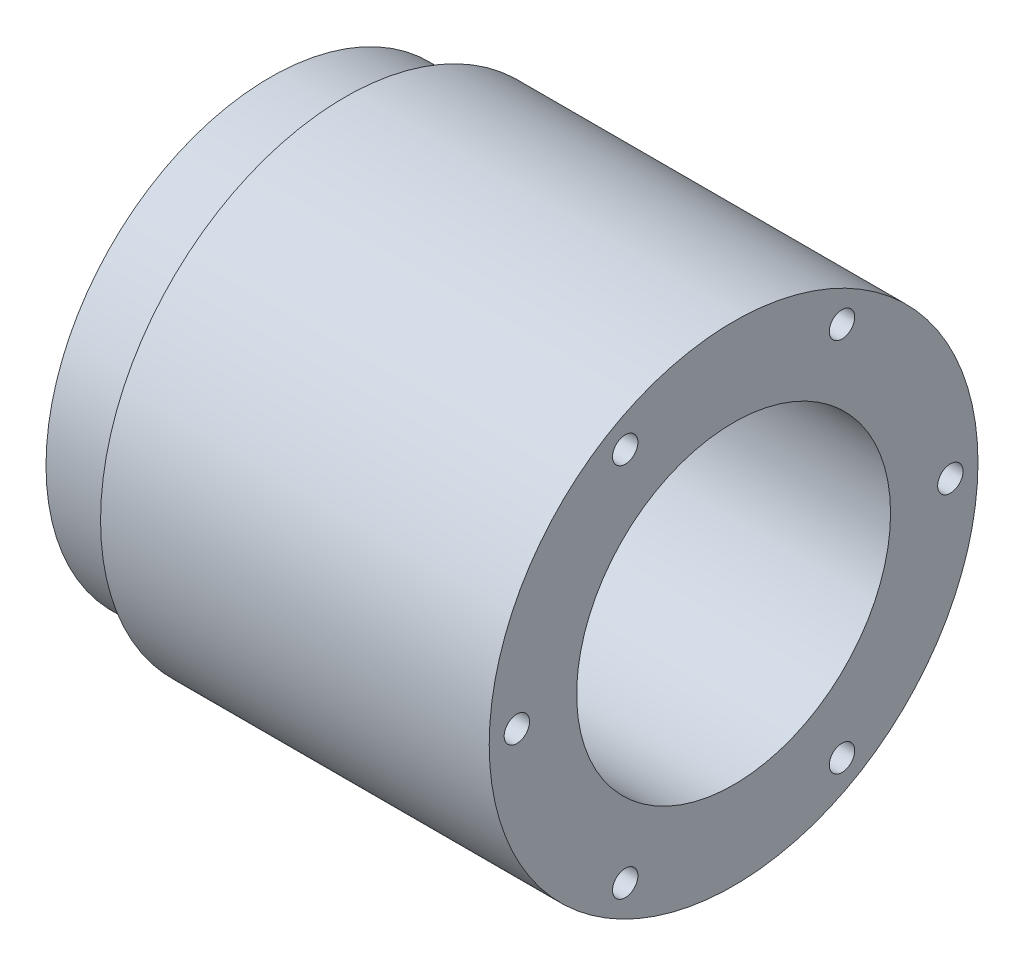
ISO-10303-21;
HEADER;
FILE_DESCRIPTION(('STEP AP214'),'2;1');
FILE_NAME('part.step','',(''),(''),'','','');
FILE_SCHEMA(('AUTOMOTIVE_DESIGN { 1 0 10303 214 1 1 1 1 }'));
ENDSEC;
DATA;
#1=APPLICATION_CONTEXT('core data for automotive mechanical design processes');
#2=APPLICATION_PROTOCOL_DEFINITION('international standard','automotive_design',2000,#1);
#3=PRODUCT_CONTEXT('',#1,'mechanical');
#4=PRODUCT('Part','Part','',(#3));
#5=PRODUCT_RELATED_PRODUCT_CATEGORY('part','',(#4));
#6=PRODUCT_DEFINITION_FORMATION('','',#4);
#7=PRODUCT_DEFINITION_CONTEXT('part definition',#1,'design');
#8=PRODUCT_DEFINITION('design','',#6,#7);
#9=PRODUCT_DEFINITION_SHAPE('','',#8);
#10=(LENGTH_UNIT() NAMED_UNIT(*) SI_UNIT(.MILLI.,.METRE.));
#11=(NAMED_UNIT(*) PLANE_ANGLE_UNIT() SI_UNIT($,.RADIAN.));
#12=(NAMED_UNIT(*) SI_UNIT($,.STERADIAN.) SOLID_ANGLE_UNIT());
#13=UNCERTAINTY_MEASURE_WITH_UNIT(LENGTH_MEASURE(1.E-05),#10,'distance_accuracy_value','');
#14=(GEOMETRIC_REPRESENTATION_CONTEXT(3) GLOBAL_UNCERTAINTY_ASSIGNED_CONTEXT((#13)) GLOBAL_UNIT_ASSIGNED_CONTEXT((#10,
#11,#12)) REPRESENTATION_CONTEXT('',''));
#15=CARTESIAN_POINT('',(0.,0.,0.));
#16=DIRECTION('',(0.,0.,1.));
#17=DIRECTION('',(1.,0.,0.));
#18=AXIS2_PLACEMENT_3D('',#15,#16,#17);
#19=CARTESIAN_POINT('',(-23.5,0.,0.));
#20=DIRECTION('',(1.,0.,0.));
#21=DIRECTION('',(0.,0.,-1.));
#22=AXIS2_PLACEMENT_3D('',#19,#20,#21);
#23=PLANE('',#22);
#24=CARTESIAN_POINT('',(-23.5,0.,0.));
#25=DIRECTION('',(1.,0.,0.));
#26=DIRECTION('',(0.,0.,-1.));
#27=AXIS2_PLACEMENT_3D('',#24,#25,#26);
#28=CIRCLE('',#27,21.);
#29=CARTESIAN_POINT('',(-23.5,0.,21.));
#30=VERTEX_POINT('',#29);
#31=CARTESIAN_POINT('',(-23.5,-12.3354484197474,16.9951967415429));
#32=VERTEX_POINT('',#31);
#33=EDGE_CURVE('E413',#30,#32,#28,.T.);
#34=ORIENTED_EDGE('',*,*,#33,.T.);
#35=CARTESIAN_POINT('',(-23.5,-15.5,15.5));
#36=DIRECTION('',(-1.,0.,0.));
#37=DIRECTION('',(0.,0.,1.));
#38=AXIS2_PLACEMENT_3D('',#35,#36,#37);
#39=CIRCLE('',#38,3.5);
#40=CARTESIAN_POINT('',(-23.5,-16.9951967415429,12.3354484197474));
#41=VERTEX_POINT('',#40);
#42=EDGE_CURVE('E245',#41,#32,#39,.T.);
#43=ORIENTED_EDGE('',*,*,#42,.F.);
#44=CARTESIAN_POINT('',(-23.5,-21.,0.));
#45=VERTEX_POINT('',#44);
#46=EDGE_CURVE('E414',#41,#45,#28,.T.);
#47=ORIENTED_EDGE('',*,*,#46,.T.);
#48=DIRECTION('',(0.,0.,1.));
#49=VECTOR('',#48,1.);
#50=CARTESIAN_POINT('',(-23.5,-21.,-18.));
#51=LINE('',#50,#49);
#52=CARTESIAN_POINT('',(-23.5,-21.,18.));
#53=VERTEX_POINT('',#52);
#54=EDGE_CURVE('E288',#45,#53,#51,.T.);
#55=ORIENTED_EDGE('',*,*,#54,.T.);
#56=CARTESIAN_POINT('',(-23.5,-18.,18.));
#57=DIRECTION('',(-1.,0.,0.));
#58=DIRECTION('',(0.,0.,1.));
#59=AXIS2_PLACEMENT_3D('',#56,#57,#58);
#60=CIRCLE('',#59,3.);
#61=CARTESIAN_POINT('',(-23.5,-18.,21.));
#62=VERTEX_POINT('',#61);
#63=EDGE_CURVE('E259',#53,#62,#60,.T.);
#64=ORIENTED_EDGE('',*,*,#63,.T.);
#65=DIRECTION('',(0.,1.,0.));
#66=VECTOR('',#65,1.);
#67=CARTESIAN_POINT('',(-23.5,18.,21.));
#68=LINE('',#67,#66);
#69=EDGE_CURVE('E263',#62,#30,#68,.T.);
#70=ORIENTED_EDGE('',*,*,#69,.T.);
#71=EDGE_LOOP('',(#34,#43,#47,#55,#64,#70));
#72=FACE_BOUND('',#71,.T.);
#73=ADVANCED_FACE('F32',(#72),#23,.F.);
#74=CARTESIAN_POINT('',(-23.5,21.,0.));
#75=VERTEX_POINT('',#74);
#76=CARTESIAN_POINT('',(-23.5,16.9951967415429,12.3354484197474));
#77=VERTEX_POINT('',#76);
#78=EDGE_CURVE('E318',#75,#77,#28,.T.);
#79=ORIENTED_EDGE('',*,*,#78,.T.);
#80=CARTESIAN_POINT('',(-23.5,15.5,15.5));
#81=DIRECTION('',(-1.,0.,0.));
#82=DIRECTION('',(0.,0.,1.));
#83=AXIS2_PLACEMENT_3D('',#80,#81,#82);
#84=CIRCLE('',#83,3.5);
#85=CARTESIAN_POINT('',(-23.5,12.3354484197474,16.9951967415429));
#86=VERTEX_POINT('',#85);
#87=EDGE_CURVE('E249',#86,#77,#84,.T.);
#88=ORIENTED_EDGE('',*,*,#87,.F.);
#89=EDGE_CURVE('E317',#86,#30,#28,.T.);
#90=ORIENTED_EDGE('',*,*,#89,.T.);
#91=CARTESIAN_POINT('',(-23.5,18.,21.));
#92=VERTEX_POINT('',#91);
#93=EDGE_CURVE('E267',#30,#92,#68,.T.);
#94=ORIENTED_EDGE('',*,*,#93,.T.);
#95=CARTESIAN_POINT('',(-23.5,18.,18.));
#96=DIRECTION('',(-1.,0.,0.));
#97=DIRECTION('',(0.,0.,-1.));
#98=AXIS2_PLACEMENT_3D('',#95,#96,#97);
#99=CIRCLE('',#98,3.);
#100=CARTESIAN_POINT('',(-23.5,21.,18.));
#101=VERTEX_POINT('',#100);
#102=EDGE_CURVE('E266',#92,#101,#99,.T.);
#103=ORIENTED_EDGE('',*,*,#102,.T.);
#104=DIRECTION('',(0.,0.,-1.));
#105=VECTOR('',#104,1.);
#106=CARTESIAN_POINT('',(-23.5,21.,-18.));
#107=LINE('',#106,#105);
#108=EDGE_CURVE('E270',#101,#75,#107,.T.);
#109=ORIENTED_EDGE('',*,*,#108,.T.);
#110=EDGE_LOOP('',(#79,#88,#90,#94,#103,#109));
#111=FACE_BOUND('',#110,.T.);
#112=ADVANCED_FACE('F373',(#111),#23,.F.);
#113=CARTESIAN_POINT('',(-23.5,0.,-21.));
#114=VERTEX_POINT('',#113);
#115=CARTESIAN_POINT('',(-23.5,12.3354484197474,-16.9951967415429));
#116=VERTEX_POINT('',#115);
#117=EDGE_CURVE('E313',#114,#116,#28,.T.);
#118=ORIENTED_EDGE('',*,*,#117,.T.);
#119=CARTESIAN_POINT('',(-23.5,15.5,-15.5));
#120=DIRECTION('',(-1.,0.,0.));
#121=DIRECTION('',(0.,0.,1.));
#122=AXIS2_PLACEMENT_3D('',#119,#120,#121);
#123=CIRCLE('',#122,3.5);
#124=CARTESIAN_POINT('',(-23.5,16.9951967415429,-12.3354484197474));
#125=VERTEX_POINT('',#124);
#126=EDGE_CURVE('E250',#125,#116,#123,.T.);
#127=ORIENTED_EDGE('',*,*,#126,.F.);
#128=EDGE_CURVE('E316',#125,#75,#28,.T.);
#129=ORIENTED_EDGE('',*,*,#128,.T.);
#130=CARTESIAN_POINT('',(-23.5,21.,-18.));
#131=VERTEX_POINT('',#130);
#132=EDGE_CURVE('E274',#75,#131,#107,.T.);
#133=ORIENTED_EDGE('',*,*,#132,.T.);
#134=CARTESIAN_POINT('',(-23.5,18.,-18.));
#135=DIRECTION('',(-1.,0.,0.));
#136=DIRECTION('',(0.,0.,1.));
#137=AXIS2_PLACEMENT_3D('',#134,#135,#136);
#138=CIRCLE('',#137,3.);
#139=CARTESIAN_POINT('',(-23.5,18.,-21.));
#140=VERTEX_POINT('',#139);
#141=EDGE_CURVE('E273',#131,#140,#138,.T.);
#142=ORIENTED_EDGE('',*,*,#141,.T.);
#143=DIRECTION('',(0.,-1.,0.));
#144=VECTOR('',#143,1.);
#145=CARTESIAN_POINT('',(-23.5,18.,-21.));
#146=LINE('',#145,#144);
#147=EDGE_CURVE('E277',#140,#114,#146,.T.);
#148=ORIENTED_EDGE('',*,*,#147,.T.);
#149=EDGE_LOOP('',(#118,#127,#129,#133,#142,#148));
#150=FACE_BOUND('',#149,.T.);
#151=ADVANCED_FACE('F379',(#150),#23,.F.);
#152=CARTESIAN_POINT('',(23.5,0.,0.));
#153=DIRECTION('',(1.,0.,0.));
#154=DIRECTION('',(0.,0.,-1.));
#155=AXIS2_PLACEMENT_3D('',#152,#153,#154);
#156=PLANE('',#155);
#157=CARTESIAN_POINT('',(23.5,0.,-29.));
#158=DIRECTION('',(1.,0.,0.));
#159=DIRECTION('',(0.,0.,-1.));
#160=AXIS2_PLACEMENT_3D('',#157,#158,#159);
#161=CIRCLE('',#160,1.69999999999999);
#162=CARTESIAN_POINT('',(23.5,0.,-30.7));
#163=VERTEX_POINT('',#162);
#164=EDGE_CURVE('E185',#163,#163,#161,.T.);
#165=ORIENTED_EDGE('',*,*,#164,.F.);
#166=EDGE_LOOP('',(#165));
#167=FACE_BOUND('',#166,.T.);
#168=CARTESIAN_POINT('',(23.5,-25.1147367097487,-14.5));
#169=DIRECTION('',(1.,0.,0.));
#170=DIRECTION('',(0.,0.,-1.));
#171=AXIS2_PLACEMENT_3D('',#168,#169,#170);
#172=CIRCLE('',#171,1.69999999999999);
#173=CARTESIAN_POINT('',(23.5,-25.1147367097487,-16.2));
#174=VERTEX_POINT('',#173);
#175=EDGE_CURVE('E184',#174,#174,#172,.T.);
#176=ORIENTED_EDGE('',*,*,#175,.F.);
#177=EDGE_LOOP('',(#176));
#178=FACE_BOUND('',#177,.T.);
#179=CARTESIAN_POINT('',(23.5,-25.1147367097487,14.5));
#180=DIRECTION('',(1.,0.,0.));
#181=DIRECTION('',(0.,0.,-1.));
#182=AXIS2_PLACEMENT_3D('',#179,#180,#181);
#183=CIRCLE('',#182,1.69999999999999);
#184=CARTESIAN_POINT('',(23.5,-25.1147367097487,12.8));
#185=VERTEX_POINT('',#184);
#186=EDGE_CURVE('E195',#185,#185,#183,.T.);
#187=ORIENTED_EDGE('',*,*,#186,.F.);
#188=EDGE_LOOP('',(#187));
#189=FACE_BOUND('',#188,.T.);
#190=CARTESIAN_POINT('',(23.5,0.,29.));
#191=DIRECTION('',(1.,0.,0.));
#192=DIRECTION('',(0.,0.,-1.));
#193=AXIS2_PLACEMENT_3D('',#190,#191,#192);
#194=CIRCLE('',#193,1.69999999999999);
#195=CARTESIAN_POINT('',(23.5,0.,27.3));
#196=VERTEX_POINT('',#195);
#197=EDGE_CURVE('E201',#196,#196,#194,.T.);
#198=ORIENTED_EDGE('',*,*,#197,.F.);
#199=EDGE_LOOP('',(#198));
#200=FACE_BOUND('',#199,.T.);
#201=CARTESIAN_POINT('',(23.5,25.1147367097487,14.5));
#202=DIRECTION('',(1.,0.,0.));
#203=DIRECTION('',(0.,0.,-1.));
#204=AXIS2_PLACEMENT_3D('',#201,#202,#203);
#205=CIRCLE('',#204,1.69999999999999);
#206=CARTESIAN_POINT('',(23.5,25.1147367097487,12.8));
#207=VERTEX_POINT('',#206);
#208=EDGE_CURVE('E207',#207,#207,#205,.T.);
#209=ORIENTED_EDGE('',*,*,#208,.F.);
#210=EDGE_LOOP('',(#209));
#211=FACE_BOUND('',#210,.T.);
#212=CARTESIAN_POINT('',(23.5,25.1147367097487,-14.5));
#213=DIRECTION('',(1.,0.,0.));
#214=DIRECTION('',(0.,0.,-1.));
#215=AXIS2_PLACEMENT_3D('',#212,#213,#214);
#216=CIRCLE('',#215,1.69999999999999);
#217=CARTESIAN_POINT('',(23.5,25.1147367097487,-16.2));
#218=VERTEX_POINT('',#217);
#219=EDGE_CURVE('E213',#218,#218,#216,.T.);
#220=ORIENTED_EDGE('',*,*,#219,.F.);
#221=EDGE_LOOP('',(#220));
#222=FACE_BOUND('',#221,.T.);
#223=CARTESIAN_POINT('',(23.5,0.,0.));
#224=DIRECTION('',(1.,0.,0.));
#225=DIRECTION('',(0.,0.,-1.));
#226=AXIS2_PLACEMENT_3D('',#223,#224,#225);
#227=CIRCLE('',#226,32.7);
#228=CARTESIAN_POINT('',(23.5,0.,-32.7));
#229=VERTEX_POINT('',#228);
#230=EDGE_CURVE('E312',#229,#229,#227,.T.);
#231=ORIENTED_EDGE('',*,*,#230,.T.);
#232=EDGE_LOOP('',(#231));
#233=FACE_BOUND('',#232,.T.);
#234=CARTESIAN_POINT('',(23.5,0.,0.));
#235=DIRECTION('',(1.,0.,0.));
#236=DIRECTION('',(0.,0.,-1.));
#237=AXIS2_PLACEMENT_3D('',#234,#235,#236);
#238=CIRCLE('',#237,21.);
#239=CARTESIAN_POINT('',(23.5,0.,-21.));
#240=VERTEX_POINT('',#239);
#241=EDGE_CURVE('E309',#240,#240,#238,.T.);
#242=ORIENTED_EDGE('',*,*,#241,.F.);
#243=EDGE_LOOP('',(#242));
#244=FACE_BOUND('',#243,.T.);
#245=ADVANCED_FACE('F383',(#167,#178,#189,#200,#211,#222,#233,#244),#156,.T.);
#246=CARTESIAN_POINT('',(-23.5,-16.9951967415429,-12.3354484197474));
#247=VERTEX_POINT('',#246);
#248=EDGE_CURVE('E412',#45,#247,#28,.T.);
#249=ORIENTED_EDGE('',*,*,#248,.T.);
#250=CARTESIAN_POINT('',(-23.5,-15.5,-15.5));
#251=DIRECTION('',(-1.,0.,0.));
#252=DIRECTION('',(0.,0.,1.));
#253=AXIS2_PLACEMENT_3D('',#250,#251,#252);
#254=CIRCLE('',#253,3.5);
#255=CARTESIAN_POINT('',(-23.5,-12.3354484197474,-16.9951967415429));
#256=VERTEX_POINT('',#255);
#257=EDGE_CURVE('E253',#256,#247,#254,.T.);
#258=ORIENTED_EDGE('',*,*,#257,.F.);
#259=EDGE_CURVE('E308',#256,#114,#28,.T.);
#260=ORIENTED_EDGE('',*,*,#259,.T.);
#261=CARTESIAN_POINT('',(-23.5,-18.,-21.));
#262=VERTEX_POINT('',#261);
#263=EDGE_CURVE('E281',#114,#262,#146,.T.);
#264=ORIENTED_EDGE('',*,*,#263,.T.);
#265=CARTESIAN_POINT('',(-23.5,-18.,-18.));
#266=DIRECTION('',(-1.,0.,0.));
#267=DIRECTION('',(0.,0.,1.));
#268=AXIS2_PLACEMENT_3D('',#265,#266,#267);
#269=CIRCLE('',#268,3.);
#270=CARTESIAN_POINT('',(-23.5,-21.,-18.));
#271=VERTEX_POINT('',#270);
#272=EDGE_CURVE('E280',#262,#271,#269,.T.);
#273=ORIENTED_EDGE('',*,*,#272,.T.);
#274=EDGE_CURVE('E284',#271,#45,#51,.T.);
#275=ORIENTED_EDGE('',*,*,#274,.T.);
#276=EDGE_LOOP('',(#249,#258,#260,#264,#273,#275));
#277=FACE_BOUND('',#276,.T.);
#278=ADVANCED_FACE('F375',(#277),#23,.F.);
#279=CARTESIAN_POINT('',(23.5,0.,0.));
#280=DIRECTION('',(-1.,0.,0.));
#281=DIRECTION('',(0.,0.,1.));
#282=AXIS2_PLACEMENT_3D('',#279,#280,#281);
#283=CYLINDRICAL_SURFACE('',#282,32.7);
#284=ORIENTED_EDGE('',*,*,#230,.F.);
#285=EDGE_LOOP('',(#284));
#286=FACE_BOUND('',#285,.T.);
#287=CARTESIAN_POINT('',(-28.5,0.,0.));
#288=DIRECTION('',(-1.,0.,0.));
#289=DIRECTION('',(0.,0.,1.));
#290=AXIS2_PLACEMENT_3D('',#287,#288,#289);
#291=CIRCLE('',#290,32.7);
#292=CARTESIAN_POINT('',(-28.5,0.,32.7));
#293=VERTEX_POINT('',#292);
#294=EDGE_CURVE('E305',#293,#293,#291,.T.);
#295=ORIENTED_EDGE('',*,*,#294,.F.);
#296=EDGE_LOOP('',(#295));
#297=FACE_BOUND('',#296,.T.);
#298=ADVANCED_FACE('F34',(#286,#297),#283,.T.);
#299=CARTESIAN_POINT('',(23.5,0.,0.));
#300=DIRECTION('',(-1.,0.,0.));
#301=DIRECTION('',(0.,0.,1.));
#302=AXIS2_PLACEMENT_3D('',#299,#300,#301);
#303=CYLINDRICAL_SURFACE('',#302,21.);
#304=DIRECTION('',(-1.,0.,0.));
#305=VECTOR('',#304,1.);
#306=CARTESIAN_POINT('',(-20.5,-12.3354484197474,16.9951967415429));
#307=LINE('',#306,#305);
#308=CARTESIAN_POINT('',(-17.5,-12.3354484197474,16.9951967415429));
#309=VERTEX_POINT('',#308);
#310=EDGE_CURVE('E36',#32,#309,#307,.F.);
#311=ORIENTED_EDGE('',*,*,#310,.F.);
#312=ORIENTED_EDGE('',*,*,#33,.F.);
#313=ORIENTED_EDGE('',*,*,#89,.F.);
#314=DIRECTION('',(-1.,0.,0.));
#315=VECTOR('',#314,1.);
#316=CARTESIAN_POINT('',(-20.5,12.3354484197474,16.9951967415429));
#317=LINE('',#316,#315);
#318=CARTESIAN_POINT('',(-17.5,12.3354484197474,16.9951967415429));
#319=VERTEX_POINT('',#318);
#320=EDGE_CURVE('E324',#319,#86,#317,.T.);
#321=ORIENTED_EDGE('',*,*,#320,.F.);
#322=CARTESIAN_POINT('',(-17.5,0.,0.));
#323=DIRECTION('',(-1.,0.,0.));
#324=DIRECTION('',(0.,0.,1.));
#325=AXIS2_PLACEMENT_3D('',#322,#323,#324);
#326=CIRCLE('',#325,21.);
#327=CARTESIAN_POINT('',(-17.5,16.9951967415429,12.3354484197474));
#328=VERTEX_POINT('',#327);
#329=EDGE_CURVE('E321',#319,#328,#326,.T.);
#330=ORIENTED_EDGE('',*,*,#329,.T.);
#331=DIRECTION('',(-1.,0.,0.));
#332=VECTOR('',#331,1.);
#333=CARTESIAN_POINT('',(-20.5,16.9951967415429,12.3354484197474));
#334=LINE('',#333,#332);
#335=EDGE_CURVE('E326',#77,#328,#334,.F.);
#336=ORIENTED_EDGE('',*,*,#335,.F.);
#337=ORIENTED_EDGE('',*,*,#78,.F.);
#338=ORIENTED_EDGE('',*,*,#128,.F.);
#339=DIRECTION('',(-1.,0.,0.));
#340=VECTOR('',#339,1.);
#341=CARTESIAN_POINT('',(-20.5,16.9951967415429,-12.3354484197474));
#342=LINE('',#341,#340);
#343=CARTESIAN_POINT('',(-17.5,16.9951967415429,-12.3354484197474));
#344=VERTEX_POINT('',#343);
#345=EDGE_CURVE('E332',#344,#125,#342,.T.);
#346=ORIENTED_EDGE('',*,*,#345,.F.);
#347=CARTESIAN_POINT('',(-17.5,0.,0.));
#348=DIRECTION('',(-1.,0.,0.));
#349=DIRECTION('',(0.,0.,1.));
#350=AXIS2_PLACEMENT_3D('',#347,#348,#349);
#351=CIRCLE('',#350,21.);
#352=CARTESIAN_POINT('',(-17.5,12.3354484197474,-16.9951967415429));
#353=VERTEX_POINT('',#352);
#354=EDGE_CURVE('E329',#344,#353,#351,.T.);
#355=ORIENTED_EDGE('',*,*,#354,.T.);
#356=DIRECTION('',(-1.,0.,0.));
#357=VECTOR('',#356,1.);
#358=CARTESIAN_POINT('',(-20.5,12.3354484197474,-16.9951967415429));
#359=LINE('',#358,#357);
#360=EDGE_CURVE('E334',#116,#353,#359,.F.);
#361=ORIENTED_EDGE('',*,*,#360,.F.);
#362=ORIENTED_EDGE('',*,*,#117,.F.);
#363=ORIENTED_EDGE('',*,*,#259,.F.);
#364=DIRECTION('',(-1.,0.,0.));
#365=VECTOR('',#364,1.);
#366=CARTESIAN_POINT('',(-20.5,-12.3354484197474,-16.9951967415429));
#367=LINE('',#366,#365);
#368=CARTESIAN_POINT('',(-17.5,-12.3354484197474,-16.9951967415429));
#369=VERTEX_POINT('',#368);
#370=EDGE_CURVE('E340',#369,#256,#367,.T.);
#371=ORIENTED_EDGE('',*,*,#370,.F.);
#372=CARTESIAN_POINT('',(-17.5,0.,0.));
#373=DIRECTION('',(-1.,0.,0.));
#374=DIRECTION('',(0.,0.,1.));
#375=AXIS2_PLACEMENT_3D('',#372,#373,#374);
#376=CIRCLE('',#375,21.);
#377=CARTESIAN_POINT('',(-17.5,-16.9951967415429,-12.3354484197474));
#378=VERTEX_POINT('',#377);
#379=EDGE_CURVE('E337',#369,#378,#376,.T.);
#380=ORIENTED_EDGE('',*,*,#379,.T.);
#381=DIRECTION('',(-1.,0.,0.));
#382=VECTOR('',#381,1.);
#383=CARTESIAN_POINT('',(-20.5,-16.9951967415429,-12.3354484197474));
#384=LINE('',#383,#382);
#385=EDGE_CURVE('E342',#247,#378,#384,.F.);
#386=ORIENTED_EDGE('',*,*,#385,.F.);
#387=ORIENTED_EDGE('',*,*,#248,.F.);
#388=ORIENTED_EDGE('',*,*,#46,.F.);
#389=DIRECTION('',(-1.,0.,0.));
#390=VECTOR('',#389,1.);
#391=CARTESIAN_POINT('',(-20.5,-16.9951967415429,12.3354484197474));
#392=LINE('',#391,#390);
#393=CARTESIAN_POINT('',(-17.5,-16.9951967415429,12.3354484197474));
#394=VERTEX_POINT('',#393);
#395=EDGE_CURVE('E346',#394,#41,#392,.T.);
#396=ORIENTED_EDGE('',*,*,#395,.F.);
#397=CARTESIAN_POINT('',(-17.5,0.,0.));
#398=DIRECTION('',(-1.,0.,0.));
#399=DIRECTION('',(0.,0.,1.));
#400=AXIS2_PLACEMENT_3D('',#397,#398,#399);
#401=CIRCLE('',#400,21.);
#402=EDGE_CURVE('E344',#394,#309,#401,.T.);
#403=ORIENTED_EDGE('',*,*,#402,.T.);
#404=EDGE_LOOP('',(#311,#312,#313,#321,#330,#336,#337,#338,#346,#355,#361,#362,#363,#371,#380,
#386,#387,#388,#396,#403));
#405=FACE_BOUND('',#404,.T.);
#406=ORIENTED_EDGE('',*,*,#241,.T.);
#407=EDGE_LOOP('',(#406));
#408=FACE_BOUND('',#407,.T.);
#409=ADVANCED_FACE('F355',(#405,#408),#303,.F.);
#410=CARTESIAN_POINT('',(-28.5,0.,0.));
#411=DIRECTION('',(-1.,0.,0.));
#412=DIRECTION('',(0.,0.,1.));
#413=AXIS2_PLACEMENT_3D('',#410,#411,#412);
#414=PLANE('',#413);
#415=CARTESIAN_POINT('',(-28.5,0.,0.));
#416=DIRECTION('',(-1.,0.,0.));
#417=DIRECTION('',(0.,0.,1.));
#418=AXIS2_PLACEMENT_3D('',#415,#416,#417);
#419=CIRCLE('',#418,30.);
#420=CARTESIAN_POINT('',(-28.5,0.,30.));
#421=VERTEX_POINT('',#420);
#422=EDGE_CURVE('E11',#421,#421,#419,.T.);
#423=ORIENTED_EDGE('',*,*,#422,.F.);
#424=EDGE_LOOP('',(#423));
#425=FACE_BOUND('',#424,.T.);
#426=ORIENTED_EDGE('',*,*,#294,.T.);
#427=EDGE_LOOP('',(#426));
#428=FACE_BOUND('',#427,.T.);
#429=ADVANCED_FACE('F533',(#425,#428),#414,.T.);
#430=CARTESIAN_POINT('',(-28.5,-18.,18.));
#431=DIRECTION('',(1.,0.,0.));
#432=DIRECTION('',(0.,0.,-1.));
#433=AXIS2_PLACEMENT_3D('',#430,#431,#432);
#434=CYLINDRICAL_SURFACE('',#433,3.);
#435=ORIENTED_EDGE('',*,*,#63,.F.);
#436=DIRECTION('',(1.,0.,0.));
#437=VECTOR('',#436,1.);
#438=CARTESIAN_POINT('',(-28.5,-21.,18.));
#439=LINE('',#438,#437);
#440=CARTESIAN_POINT('',(-38.5,-21.,18.));
#441=VERTEX_POINT('',#440);
#442=EDGE_CURVE('E287',#441,#53,#439,.T.);
#443=ORIENTED_EDGE('',*,*,#442,.F.);
#444=CARTESIAN_POINT('',(-38.5,-18.,18.));
#445=DIRECTION('',(-1.,0.,0.));
#446=DIRECTION('',(0.,0.,1.));
#447=AXIS2_PLACEMENT_3D('',#444,#445,#446);
#448=CIRCLE('',#447,3.);
#449=CARTESIAN_POINT('',(-38.5,-18.,21.));
#450=VERTEX_POINT('',#449);
#451=EDGE_CURVE('E237',#441,#450,#448,.T.);
#452=ORIENTED_EDGE('',*,*,#451,.T.);
#453=DIRECTION('',(1.,0.,0.));
#454=VECTOR('',#453,1.);
#455=CARTESIAN_POINT('',(-28.5,-18.,21.));
#456=LINE('',#455,#454);
#457=EDGE_CURVE('E302',#450,#62,#456,.T.);
#458=ORIENTED_EDGE('',*,*,#457,.T.);
#459=EDGE_LOOP('',(#435,#443,#452,#458));
#460=FACE_BOUND('',#459,.T.);
#461=ADVANCED_FACE('F430',(#460),#434,.F.);
#462=CARTESIAN_POINT('',(-28.5,18.,21.));
#463=DIRECTION('',(0.,0.,-1.));
#464=DIRECTION('',(-1.,0.,0.));
#465=AXIS2_PLACEMENT_3D('',#462,#463,#464);
#466=PLANE('',#465);
#467=ORIENTED_EDGE('',*,*,#69,.F.);
#468=ORIENTED_EDGE('',*,*,#457,.F.);
#469=DIRECTION('',(0.,1.,0.));
#470=VECTOR('',#469,1.);
#471=CARTESIAN_POINT('',(-38.5,-18.,21.));
#472=LINE('',#471,#470);
#473=CARTESIAN_POINT('',(-38.5,18.,21.));
#474=VERTEX_POINT('',#473);
#475=EDGE_CURVE('E240',#450,#474,#472,.T.);
#476=ORIENTED_EDGE('',*,*,#475,.T.);
#477=DIRECTION('',(1.,0.,0.));
#478=VECTOR('',#477,1.);
#479=CARTESIAN_POINT('',(-28.5,18.,21.));
#480=LINE('',#479,#478);
#481=EDGE_CURVE('E300',#474,#92,#480,.T.);
#482=ORIENTED_EDGE('',*,*,#481,.T.);
#483=ORIENTED_EDGE('',*,*,#93,.F.);
#484=EDGE_LOOP('',(#467,#468,#476,#482,#483));
#485=FACE_BOUND('',#484,.T.);
#486=ADVANCED_FACE('F426',(#485),#466,.T.);
#487=CARTESIAN_POINT('',(-28.5,18.,18.));
#488=DIRECTION('',(1.,0.,0.));
#489=DIRECTION('',(0.,0.,-1.));
#490=AXIS2_PLACEMENT_3D('',#487,#488,#489);
#491=CYLINDRICAL_SURFACE('',#490,3.);
#492=ORIENTED_EDGE('',*,*,#102,.F.);
#493=ORIENTED_EDGE('',*,*,#481,.F.);
#494=CARTESIAN_POINT('',(-38.5,18.,18.));
#495=DIRECTION('',(-1.,0.,0.));
#496=DIRECTION('',(0.,0.,1.));
#497=AXIS2_PLACEMENT_3D('',#494,#495,#496);
#498=CIRCLE('',#497,3.);
#499=CARTESIAN_POINT('',(-38.5,21.,18.));
#500=VERTEX_POINT('',#499);
#501=EDGE_CURVE('E219',#474,#500,#498,.T.);
#502=ORIENTED_EDGE('',*,*,#501,.T.);
#503=DIRECTION('',(1.,0.,0.));
#504=VECTOR('',#503,1.);
#505=CARTESIAN_POINT('',(-28.5,21.,18.));
#506=LINE('',#505,#504);
#507=EDGE_CURVE('E298',#500,#101,#506,.T.);
#508=ORIENTED_EDGE('',*,*,#507,.T.);
#509=EDGE_LOOP('',(#492,#493,#502,#508));
#510=FACE_BOUND('',#509,.T.);
#511=ADVANCED_FACE('F438',(#510),#491,.F.);
#512=CARTESIAN_POINT('',(-28.5,21.,-18.));
#513=DIRECTION('',(0.,-1.,0.));
#514=DIRECTION('',(0.,0.,-1.));
#515=AXIS2_PLACEMENT_3D('',#512,#513,#514);
#516=PLANE('',#515);
#517=ORIENTED_EDGE('',*,*,#108,.F.);
#518=ORIENTED_EDGE('',*,*,#507,.F.);
#519=DIRECTION('',(0.,0.,-1.));
#520=VECTOR('',#519,1.);
#521=CARTESIAN_POINT('',(-38.5,21.,18.));
#522=LINE('',#521,#520);
#523=CARTESIAN_POINT('',(-38.5,21.,-18.));
#524=VERTEX_POINT('',#523);
#525=EDGE_CURVE('E222',#500,#524,#522,.T.);
#526=ORIENTED_EDGE('',*,*,#525,.T.);
#527=DIRECTION('',(1.,0.,0.));
#528=VECTOR('',#527,1.);
#529=CARTESIAN_POINT('',(-28.5,21.,-18.));
#530=LINE('',#529,#528);
#531=EDGE_CURVE('E296',#524,#131,#530,.T.);
#532=ORIENTED_EDGE('',*,*,#531,.T.);
#533=ORIENTED_EDGE('',*,*,#132,.F.);
#534=EDGE_LOOP('',(#517,#518,#526,#532,#533));
#535=FACE_BOUND('',#534,.T.);
#536=ADVANCED_FACE('F441',(#535),#516,.T.);
#537=CARTESIAN_POINT('',(-28.5,18.,-18.));
#538=DIRECTION('',(1.,0.,0.));
#539=DIRECTION('',(0.,0.,-1.));
#540=AXIS2_PLACEMENT_3D('',#537,#538,#539);
#541=CYLINDRICAL_SURFACE('',#540,3.);
#542=ORIENTED_EDGE('',*,*,#141,.F.);
#543=ORIENTED_EDGE('',*,*,#531,.F.);
#544=CARTESIAN_POINT('',(-38.5,18.,-18.));
#545=DIRECTION('',(-1.,0.,0.));
#546=DIRECTION('',(0.,0.,1.));
#547=AXIS2_PLACEMENT_3D('',#544,#545,#546);
#548=CIRCLE('',#547,3.);
#549=CARTESIAN_POINT('',(-38.5,18.,-21.));
#550=VERTEX_POINT('',#549);
#551=EDGE_CURVE('E225',#524,#550,#548,.T.);
#552=ORIENTED_EDGE('',*,*,#551,.T.);
#553=DIRECTION('',(1.,0.,0.));
#554=VECTOR('',#553,1.);
#555=CARTESIAN_POINT('',(-28.5,18.,-21.));
#556=LINE('',#555,#554);
#557=EDGE_CURVE('E294',#550,#140,#556,.T.);
#558=ORIENTED_EDGE('',*,*,#557,.T.);
#559=EDGE_LOOP('',(#542,#543,#552,#558));
#560=FACE_BOUND('',#559,.T.);
#561=ADVANCED_FACE('F549',(#560),#541,.F.);
#562=CARTESIAN_POINT('',(-28.5,18.,-21.));
#563=DIRECTION('',(0.,0.,1.));
#564=DIRECTION('',(1.,0.,0.));
#565=AXIS2_PLACEMENT_3D('',#562,#563,#564);
#566=PLANE('',#565);
#567=ORIENTED_EDGE('',*,*,#147,.F.);
#568=ORIENTED_EDGE('',*,*,#557,.F.);
#569=DIRECTION('',(0.,-1.,0.));
#570=VECTOR('',#569,1.);
#571=CARTESIAN_POINT('',(-38.5,18.,-21.));
#572=LINE('',#571,#570);
#573=CARTESIAN_POINT('',(-38.5,-18.,-21.));
#574=VERTEX_POINT('',#573);
#575=EDGE_CURVE('E228',#550,#574,#572,.T.);
#576=ORIENTED_EDGE('',*,*,#575,.T.);
#577=DIRECTION('',(1.,0.,0.));
#578=VECTOR('',#577,1.);
#579=CARTESIAN_POINT('',(-28.5,-18.,-21.));
#580=LINE('',#579,#578);
#581=EDGE_CURVE('E292',#574,#262,#580,.T.);
#582=ORIENTED_EDGE('',*,*,#581,.T.);
#583=ORIENTED_EDGE('',*,*,#263,.F.);
#584=EDGE_LOOP('',(#567,#568,#576,#582,#583));
#585=FACE_BOUND('',#584,.T.);
#586=ADVANCED_FACE('F445',(#585),#566,.T.);
#587=CARTESIAN_POINT('',(-28.5,-18.,-18.));
#588=DIRECTION('',(1.,0.,0.));
#589=DIRECTION('',(0.,0.,-1.));
#590=AXIS2_PLACEMENT_3D('',#587,#588,#589);
#591=CYLINDRICAL_SURFACE('',#590,3.);
#592=ORIENTED_EDGE('',*,*,#272,.F.);
#593=ORIENTED_EDGE('',*,*,#581,.F.);
#594=CARTESIAN_POINT('',(-38.5,-18.,-18.));
#595=DIRECTION('',(-1.,0.,0.));
#596=DIRECTION('',(0.,0.,1.));
#597=AXIS2_PLACEMENT_3D('',#594,#595,#596);
#598=CIRCLE('',#597,3.);
#599=CARTESIAN_POINT('',(-38.5,-21.,-18.));
#600=VERTEX_POINT('',#599);
#601=EDGE_CURVE('E231',#574,#600,#598,.T.);
#602=ORIENTED_EDGE('',*,*,#601,.T.);
#603=DIRECTION('',(1.,0.,0.));
#604=VECTOR('',#603,1.);
#605=CARTESIAN_POINT('',(-28.5,-21.,-18.));
#606=LINE('',#605,#604);
#607=EDGE_CURVE('E290',#600,#271,#606,.T.);
#608=ORIENTED_EDGE('',*,*,#607,.T.);
#609=EDGE_LOOP('',(#592,#593,#602,#608));
#610=FACE_BOUND('',#609,.T.);
#611=ADVANCED_FACE('F449',(#610),#591,.F.);
#612=CARTESIAN_POINT('',(-28.5,-21.,-18.));
#613=DIRECTION('',(0.,1.,0.));
#614=DIRECTION('',(0.,0.,1.));
#615=AXIS2_PLACEMENT_3D('',#612,#613,#614);
#616=PLANE('',#615);
#617=ORIENTED_EDGE('',*,*,#274,.F.);
#618=ORIENTED_EDGE('',*,*,#607,.F.);
#619=DIRECTION('',(0.,0.,1.));
#620=VECTOR('',#619,1.);
#621=CARTESIAN_POINT('',(-38.5,-21.,-18.));
#622=LINE('',#621,#620);
#623=EDGE_CURVE('E234',#600,#441,#622,.T.);
#624=ORIENTED_EDGE('',*,*,#623,.T.);
#625=ORIENTED_EDGE('',*,*,#442,.T.);
#626=ORIENTED_EDGE('',*,*,#54,.F.);
#627=EDGE_LOOP('',(#617,#618,#624,#625,#626));
#628=FACE_BOUND('',#627,.T.);
#629=ADVANCED_FACE('F453',(#628),#616,.T.);
#630=CARTESIAN_POINT('',(-17.5,15.5,15.5));
#631=DIRECTION('',(-1.,0.,0.));
#632=DIRECTION('',(0.,0.,1.));
#633=AXIS2_PLACEMENT_3D('',#630,#631,#632);
#634=CYLINDRICAL_SURFACE('',#633,3.5);
#635=ORIENTED_EDGE('',*,*,#335,.T.);
#636=CARTESIAN_POINT('',(-17.5,15.5,15.5));
#637=DIRECTION('',(-1.,0.,0.));
#638=DIRECTION('',(0.,0.,1.));
#639=AXIS2_PLACEMENT_3D('',#636,#637,#638);
#640=CIRCLE('',#639,3.5);
#641=EDGE_CURVE('E257',#319,#328,#640,.T.);
#642=ORIENTED_EDGE('',*,*,#641,.F.);
#643=ORIENTED_EDGE('',*,*,#320,.T.);
#644=ORIENTED_EDGE('',*,*,#87,.T.);
#645=EDGE_LOOP('',(#635,#642,#643,#644));
#646=FACE_BOUND('',#645,.T.);
#647=ADVANCED_FACE('F559',(#646),#634,.F.);
#648=CARTESIAN_POINT('',(-17.5,15.5,15.5));
#649=DIRECTION('',(-1.,0.,0.));
#650=DIRECTION('',(0.,0.,1.));
#651=AXIS2_PLACEMENT_3D('',#648,#649,#650);
#652=PLANE('',#651);
#653=ORIENTED_EDGE('',*,*,#641,.T.);
#654=ORIENTED_EDGE('',*,*,#329,.F.);
#655=EDGE_LOOP('',(#653,#654));
#656=FACE_BOUND('',#655,.T.);
#657=ADVANCED_FACE('F469',(#656),#652,.T.);
#658=CARTESIAN_POINT('',(-17.5,15.5,-15.5));
#659=DIRECTION('',(-1.,0.,0.));
#660=DIRECTION('',(0.,0.,1.));
#661=AXIS2_PLACEMENT_3D('',#658,#659,#660);
#662=CYLINDRICAL_SURFACE('',#661,3.5);
#663=ORIENTED_EDGE('',*,*,#360,.T.);
#664=CARTESIAN_POINT('',(-17.5,15.5,-15.5));
#665=DIRECTION('',(-1.,0.,0.));
#666=DIRECTION('',(0.,0.,1.));
#667=AXIS2_PLACEMENT_3D('',#664,#665,#666);
#668=CIRCLE('',#667,3.5);
#669=EDGE_CURVE('E247',#344,#353,#668,.T.);
#670=ORIENTED_EDGE('',*,*,#669,.F.);
#671=ORIENTED_EDGE('',*,*,#345,.T.);
#672=ORIENTED_EDGE('',*,*,#126,.T.);
#673=EDGE_LOOP('',(#663,#670,#671,#672));
#674=FACE_BOUND('',#673,.T.);
#675=ADVANCED_FACE('F406',(#674),#662,.F.);
#676=CARTESIAN_POINT('',(-17.5,15.5,-15.5));
#677=DIRECTION('',(-1.,0.,0.));
#678=DIRECTION('',(0.,0.,1.));
#679=AXIS2_PLACEMENT_3D('',#676,#677,#678);
#680=PLANE('',#679);
#681=ORIENTED_EDGE('',*,*,#669,.T.);
#682=ORIENTED_EDGE('',*,*,#354,.F.);
#683=EDGE_LOOP('',(#681,#682));
#684=FACE_BOUND('',#683,.T.);
#685=ADVANCED_FACE('F459',(#684),#680,.T.);
#686=CARTESIAN_POINT('',(-17.5,-15.5,-15.5));
#687=DIRECTION('',(-1.,0.,0.));
#688=DIRECTION('',(0.,0.,1.));
#689=AXIS2_PLACEMENT_3D('',#686,#687,#688);
#690=CYLINDRICAL_SURFACE('',#689,3.5);
#691=ORIENTED_EDGE('',*,*,#385,.T.);
#692=CARTESIAN_POINT('',(-17.5,-15.5,-15.5));
#693=DIRECTION('',(-1.,0.,0.));
#694=DIRECTION('',(0.,0.,1.));
#695=AXIS2_PLACEMENT_3D('',#692,#693,#694);
#696=CIRCLE('',#695,3.5);
#697=EDGE_CURVE('E54',#369,#378,#696,.T.);
#698=ORIENTED_EDGE('',*,*,#697,.F.);
#699=ORIENTED_EDGE('',*,*,#370,.T.);
#700=ORIENTED_EDGE('',*,*,#257,.T.);
#701=EDGE_LOOP('',(#691,#698,#699,#700));
#702=FACE_BOUND('',#701,.T.);
#703=ADVANCED_FACE('F457',(#702),#690,.F.);
#704=CARTESIAN_POINT('',(-17.5,-15.5,-15.5));
#705=DIRECTION('',(-1.,0.,0.));
#706=DIRECTION('',(0.,0.,1.));
#707=AXIS2_PLACEMENT_3D('',#704,#705,#706);
#708=PLANE('',#707);
#709=ORIENTED_EDGE('',*,*,#697,.T.);
#710=ORIENTED_EDGE('',*,*,#379,.F.);
#711=EDGE_LOOP('',(#709,#710));
#712=FACE_BOUND('',#711,.T.);
#713=ADVANCED_FACE('F369',(#712),#708,.T.);
#714=CARTESIAN_POINT('',(-17.5,-15.5,15.5));
#715=DIRECTION('',(-1.,0.,0.));
#716=DIRECTION('',(0.,0.,1.));
#717=AXIS2_PLACEMENT_3D('',#714,#715,#716);
#718=CYLINDRICAL_SURFACE('',#717,3.5);
#719=ORIENTED_EDGE('',*,*,#310,.T.);
#720=CARTESIAN_POINT('',(-17.5,-15.5,15.5));
#721=DIRECTION('',(-1.,0.,0.));
#722=DIRECTION('',(0.,0.,1.));
#723=AXIS2_PLACEMENT_3D('',#720,#721,#722);
#724=CIRCLE('',#723,3.5);
#725=EDGE_CURVE('E47',#394,#309,#724,.T.);
#726=ORIENTED_EDGE('',*,*,#725,.F.);
#727=ORIENTED_EDGE('',*,*,#395,.T.);
#728=ORIENTED_EDGE('',*,*,#42,.T.);
#729=EDGE_LOOP('',(#719,#726,#727,#728));
#730=FACE_BOUND('',#729,.T.);
#731=ADVANCED_FACE('F351',(#730),#718,.F.);
#732=CARTESIAN_POINT('',(-17.5,-15.5,15.5));
#733=DIRECTION('',(-1.,0.,0.));
#734=DIRECTION('',(0.,0.,1.));
#735=AXIS2_PLACEMENT_3D('',#732,#733,#734);
#736=PLANE('',#735);
#737=ORIENTED_EDGE('',*,*,#725,.T.);
#738=ORIENTED_EDGE('',*,*,#402,.F.);
#739=EDGE_LOOP('',(#737,#738));
#740=FACE_BOUND('',#739,.T.);
#741=ADVANCED_FACE('F358',(#740),#736,.T.);
#742=CARTESIAN_POINT('',(-38.5,0.,0.));
#743=DIRECTION('',(-1.,0.,0.));
#744=DIRECTION('',(0.,0.,1.));
#745=AXIS2_PLACEMENT_3D('',#742,#743,#744);
#746=PLANE('',#745);
#747=CARTESIAN_POINT('',(-38.5,0.,0.));
#748=DIRECTION('',(-1.,0.,0.));
#749=DIRECTION('',(0.,0.,1.));
#750=AXIS2_PLACEMENT_3D('',#747,#748,#749);
#751=CIRCLE('',#750,30.);
#752=CARTESIAN_POINT('',(-38.5,0.,30.));
#753=VERTEX_POINT('',#752);
#754=EDGE_CURVE('E243',#753,#753,#751,.T.);
#755=ORIENTED_EDGE('',*,*,#754,.T.);
#756=EDGE_LOOP('',(#755));
#757=FACE_BOUND('',#756,.T.);
#758=ORIENTED_EDGE('',*,*,#525,.F.);
#759=ORIENTED_EDGE('',*,*,#501,.F.);
#760=ORIENTED_EDGE('',*,*,#475,.F.);
#761=ORIENTED_EDGE('',*,*,#451,.F.);
#762=ORIENTED_EDGE('',*,*,#623,.F.);
#763=ORIENTED_EDGE('',*,*,#601,.F.);
#764=ORIENTED_EDGE('',*,*,#575,.F.);
#765=ORIENTED_EDGE('',*,*,#551,.F.);
#766=EDGE_LOOP('',(#758,#759,#760,#761,#762,#763,#764,#765));
#767=FACE_BOUND('',#766,.T.);
#768=ADVANCED_FACE('F360',(#757,#767),#746,.T.);
#769=CARTESIAN_POINT('',(-38.5,0.,0.));
#770=DIRECTION('',(1.,0.,0.));
#771=DIRECTION('',(0.,0.,-1.));
#772=AXIS2_PLACEMENT_3D('',#769,#770,#771);
#773=CYLINDRICAL_SURFACE('',#772,30.);
#774=ORIENTED_EDGE('',*,*,#754,.F.);
#775=EDGE_LOOP('',(#774));
#776=FACE_BOUND('',#775,.T.);
#777=ORIENTED_EDGE('',*,*,#422,.T.);
#778=EDGE_LOOP('',(#777));
#779=FACE_BOUND('',#778,.T.);
#780=ADVANCED_FACE('F366',(#776,#779),#773,.T.);
#781=CARTESIAN_POINT('',(13.5,25.1147367097487,-14.5));
#782=DIRECTION('',(1.,0.,0.));
#783=DIRECTION('',(0.,0.,-1.));
#784=AXIS2_PLACEMENT_3D('',#781,#782,#783);
#785=CONICAL_SURFACE('',#784,1.69999999999999,1.02974425867665);
#786=CARTESIAN_POINT('',(12.4785369476531,25.1147367097487,-14.5));
#787=VERTEX_POINT('',#786);
#788=VERTEX_LOOP('',#787);
#789=FACE_BOUND('',#788,.T.);
#790=CARTESIAN_POINT('',(13.5,25.1147367097487,-14.5));
#791=DIRECTION('',(1.,0.,0.));
#792=DIRECTION('',(0.,0.,-1.));
#793=AXIS2_PLACEMENT_3D('',#790,#791,#792);
#794=CIRCLE('',#793,1.69999999999999);
#795=CARTESIAN_POINT('',(13.5,25.1147367097487,-16.2));
#796=VERTEX_POINT('',#795);
#797=EDGE_CURVE('E216',#796,#796,#794,.T.);
#798=ORIENTED_EDGE('',*,*,#797,.T.);
#799=EDGE_LOOP('',(#798));
#800=FACE_BOUND('',#799,.T.);
#801=ADVANCED_FACE('F472',(#789,#800),#785,.F.);
#802=CARTESIAN_POINT('',(23.5,25.1147367097487,-14.5));
#803=DIRECTION('',(1.,0.,0.));
#804=DIRECTION('',(0.,0.,-1.));
#805=AXIS2_PLACEMENT_3D('',#802,#803,#804);
#806=CYLINDRICAL_SURFACE('',#805,1.69999999999999);
#807=ORIENTED_EDGE('',*,*,#797,.F.);
#808=EDGE_LOOP('',(#807));
#809=FACE_BOUND('',#808,.T.);
#810=ORIENTED_EDGE('',*,*,#219,.T.);
#811=EDGE_LOOP('',(#810));
#812=FACE_BOUND('',#811,.T.);
#813=ADVANCED_FACE('F477',(#809,#812),#806,.F.);
#814=CARTESIAN_POINT('',(13.5,25.1147367097487,14.5));
#815=DIRECTION('',(1.,0.,0.));
#816=DIRECTION('',(0.,0.,-1.));
#817=AXIS2_PLACEMENT_3D('',#814,#815,#816);
#818=CONICAL_SURFACE('',#817,1.69999999999999,1.02974425867665);
#819=CARTESIAN_POINT('',(12.4785369476531,25.1147367097487,14.5));
#820=VERTEX_POINT('',#819);
#821=VERTEX_LOOP('',#820);
#822=FACE_BOUND('',#821,.T.);
#823=CARTESIAN_POINT('',(13.5,25.1147367097487,14.5));
#824=DIRECTION('',(1.,0.,0.));
#825=DIRECTION('',(0.,0.,-1.));
#826=AXIS2_PLACEMENT_3D('',#823,#824,#825);
#827=CIRCLE('',#826,1.69999999999999);
#828=CARTESIAN_POINT('',(13.5,25.1147367097487,12.8));
#829=VERTEX_POINT('',#828);
#830=EDGE_CURVE('E210',#829,#829,#827,.T.);
#831=ORIENTED_EDGE('',*,*,#830,.T.);
#832=EDGE_LOOP('',(#831));
#833=FACE_BOUND('',#832,.T.);
#834=ADVANCED_FACE('F481',(#822,#833),#818,.F.);
#835=CARTESIAN_POINT('',(23.5,25.1147367097487,14.5));
#836=DIRECTION('',(1.,0.,0.));
#837=DIRECTION('',(0.,0.,-1.));
#838=AXIS2_PLACEMENT_3D('',#835,#836,#837);
#839=CYLINDRICAL_SURFACE('',#838,1.69999999999999);
#840=ORIENTED_EDGE('',*,*,#830,.F.);
#841=EDGE_LOOP('',(#840));
#842=FACE_BOUND('',#841,.T.);
#843=ORIENTED_EDGE('',*,*,#208,.T.);
#844=EDGE_LOOP('',(#843));
#845=FACE_BOUND('',#844,.T.);
#846=ADVANCED_FACE('F485',(#842,#845),#839,.F.);
#847=CARTESIAN_POINT('',(13.5,0.,29.));
#848=DIRECTION('',(1.,0.,0.));
#849=DIRECTION('',(0.,0.,-1.));
#850=AXIS2_PLACEMENT_3D('',#847,#848,#849);
#851=CONICAL_SURFACE('',#850,1.69999999999999,1.02974425867665);
#852=CARTESIAN_POINT('',(12.4785369476531,0.,29.));
#853=VERTEX_POINT('',#852);
#854=VERTEX_LOOP('',#853);
#855=FACE_BOUND('',#854,.T.);
#856=CARTESIAN_POINT('',(13.5,0.,29.));
#857=DIRECTION('',(1.,0.,0.));
#858=DIRECTION('',(0.,0.,-1.));
#859=AXIS2_PLACEMENT_3D('',#856,#857,#858);
#860=CIRCLE('',#859,1.69999999999999);
#861=CARTESIAN_POINT('',(13.5,0.,27.3));
#862=VERTEX_POINT('',#861);
#863=EDGE_CURVE('E204',#862,#862,#860,.T.);
#864=ORIENTED_EDGE('',*,*,#863,.T.);
#865=EDGE_LOOP('',(#864));
#866=FACE_BOUND('',#865,.T.);
#867=ADVANCED_FACE('F489',(#855,#866),#851,.F.);
#868=CARTESIAN_POINT('',(23.5,0.,29.));
#869=DIRECTION('',(1.,0.,0.));
#870=DIRECTION('',(0.,0.,-1.));
#871=AXIS2_PLACEMENT_3D('',#868,#869,#870);
#872=CYLINDRICAL_SURFACE('',#871,1.69999999999999);
#873=ORIENTED_EDGE('',*,*,#863,.F.);
#874=EDGE_LOOP('',(#873));
#875=FACE_BOUND('',#874,.T.);
#876=ORIENTED_EDGE('',*,*,#197,.T.);
#877=EDGE_LOOP('',(#876));
#878=FACE_BOUND('',#877,.T.);
#879=ADVANCED_FACE('F493',(#875,#878),#872,.F.);
#880=CARTESIAN_POINT('',(13.5,-25.1147367097487,14.5));
#881=DIRECTION('',(1.,0.,0.));
#882=DIRECTION('',(0.,0.,-1.));
#883=AXIS2_PLACEMENT_3D('',#880,#881,#882);
#884=CONICAL_SURFACE('',#883,1.69999999999999,1.02974425867665);
#885=CARTESIAN_POINT('',(12.4785369476531,-25.1147367097487,14.5));
#886=VERTEX_POINT('',#885);
#887=VERTEX_LOOP('',#886);
#888=FACE_BOUND('',#887,.T.);
#889=CARTESIAN_POINT('',(13.5,-25.1147367097487,14.5));
#890=DIRECTION('',(1.,0.,0.));
#891=DIRECTION('',(0.,0.,-1.));
#892=AXIS2_PLACEMENT_3D('',#889,#890,#891);
#893=CIRCLE('',#892,1.69999999999999);
#894=CARTESIAN_POINT('',(13.5,-25.1147367097487,12.8));
#895=VERTEX_POINT('',#894);
#896=EDGE_CURVE('E198',#895,#895,#893,.T.);
#897=ORIENTED_EDGE('',*,*,#896,.T.);
#898=EDGE_LOOP('',(#897));
#899=FACE_BOUND('',#898,.T.);
#900=ADVANCED_FACE('F497',(#888,#899),#884,.F.);
#901=CARTESIAN_POINT('',(23.5,-25.1147367097487,14.5));
#902=DIRECTION('',(1.,0.,0.));
#903=DIRECTION('',(0.,0.,-1.));
#904=AXIS2_PLACEMENT_3D('',#901,#902,#903);
#905=CYLINDRICAL_SURFACE('',#904,1.69999999999999);
#906=ORIENTED_EDGE('',*,*,#896,.F.);
#907=EDGE_LOOP('',(#906));
#908=FACE_BOUND('',#907,.T.);
#909=ORIENTED_EDGE('',*,*,#186,.T.);
#910=EDGE_LOOP('',(#909));
#911=FACE_BOUND('',#910,.T.);
#912=ADVANCED_FACE('F501',(#908,#911),#905,.F.);
#913=CARTESIAN_POINT('',(13.5,-25.1147367097487,-14.5));
#914=DIRECTION('',(1.,0.,0.));
#915=DIRECTION('',(0.,0.,-1.));
#916=AXIS2_PLACEMENT_3D('',#913,#914,#915);
#917=CONICAL_SURFACE('',#916,1.69999999999999,1.02974425867665);
#918=CARTESIAN_POINT('',(12.4785369476531,-25.1147367097487,-14.5));
#919=VERTEX_POINT('',#918);
#920=VERTEX_LOOP('',#919);
#921=FACE_BOUND('',#920,.T.);
#922=CARTESIAN_POINT('',(13.5,-25.1147367097487,-14.5));
#923=DIRECTION('',(1.,0.,0.));
#924=DIRECTION('',(0.,0.,-1.));
#925=AXIS2_PLACEMENT_3D('',#922,#923,#924);
#926=CIRCLE('',#925,1.69999999999999);
#927=CARTESIAN_POINT('',(13.5,-25.1147367097487,-16.2));
#928=VERTEX_POINT('',#927);
#929=EDGE_CURVE('E188',#928,#928,#926,.T.);
#930=ORIENTED_EDGE('',*,*,#929,.T.);
#931=EDGE_LOOP('',(#930));
#932=FACE_BOUND('',#931,.T.);
#933=ADVANCED_FACE('F505',(#921,#932),#917,.F.);
#934=CARTESIAN_POINT('',(23.5,-25.1147367097487,-14.5));
#935=DIRECTION('',(1.,0.,0.));
#936=DIRECTION('',(0.,0.,-1.));
#937=AXIS2_PLACEMENT_3D('',#934,#935,#936);
#938=CYLINDRICAL_SURFACE('',#937,1.69999999999999);
#939=ORIENTED_EDGE('',*,*,#929,.F.);
#940=EDGE_LOOP('',(#939));
#941=FACE_BOUND('',#940,.T.);
#942=ORIENTED_EDGE('',*,*,#175,.T.);
#943=EDGE_LOOP('',(#942));
#944=FACE_BOUND('',#943,.T.);
#945=ADVANCED_FACE('F178',(#941,#944),#938,.F.);
#946=CARTESIAN_POINT('',(13.5,0.,-29.));
#947=DIRECTION('',(1.,0.,0.));
#948=DIRECTION('',(0.,0.,-1.));
#949=AXIS2_PLACEMENT_3D('',#946,#947,#948);
#950=CONICAL_SURFACE('',#949,1.69999999999999,1.02974425867665);
#951=CARTESIAN_POINT('',(12.4785369476531,0.,-29.));
#952=VERTEX_POINT('',#951);
#953=VERTEX_LOOP('',#952);
#954=FACE_BOUND('',#953,.T.);
#955=CARTESIAN_POINT('',(13.5,0.,-29.));
#956=DIRECTION('',(1.,0.,0.));
#957=DIRECTION('',(0.,0.,-1.));
#958=AXIS2_PLACEMENT_3D('',#955,#956,#957);
#959=CIRCLE('',#958,1.69999999999999);
#960=CARTESIAN_POINT('',(13.5,0.,-30.7));
#961=VERTEX_POINT('',#960);
#962=EDGE_CURVE('E182',#961,#961,#959,.T.);
#963=ORIENTED_EDGE('',*,*,#962,.T.);
#964=EDGE_LOOP('',(#963));
#965=FACE_BOUND('',#964,.T.);
#966=ADVANCED_FACE('F174',(#954,#965),#950,.F.);
#967=CARTESIAN_POINT('',(23.5,0.,-29.));
#968=DIRECTION('',(1.,0.,0.));
#969=DIRECTION('',(0.,0.,-1.));
#970=AXIS2_PLACEMENT_3D('',#967,#968,#969);
#971=CYLINDRICAL_SURFACE('',#970,1.69999999999999);
#972=ORIENTED_EDGE('',*,*,#962,.F.);
#973=EDGE_LOOP('',(#972));
#974=FACE_BOUND('',#973,.T.);
#975=ORIENTED_EDGE('',*,*,#164,.T.);
#976=EDGE_LOOP('',(#975));
#977=FACE_BOUND('',#976,.T.);
#978=ADVANCED_FACE('F177',(#974,#977),#971,.F.);
#979=CLOSED_SHELL('',(#73,#112,#151,#245,#278,#298,#409,#429,#461,#486,#511,#536,#561,#586,#611,
#629,#647,#657,#675,#685,#703,#713,#731,#741,#768,#780,#801,#813,#834,#846,#867,#879,#900,#912,
#933,#945,#966,#978));
#980=MANIFOLD_SOLID_BREP('B2',#979);
#981=ADVANCED_BREP_SHAPE_REPRESENTATION('',(#18,#980),#14);
#982=SHAPE_DEFINITION_REPRESENTATION(#9,#981);
ENDSEC;
END-ISO-10303-21;
